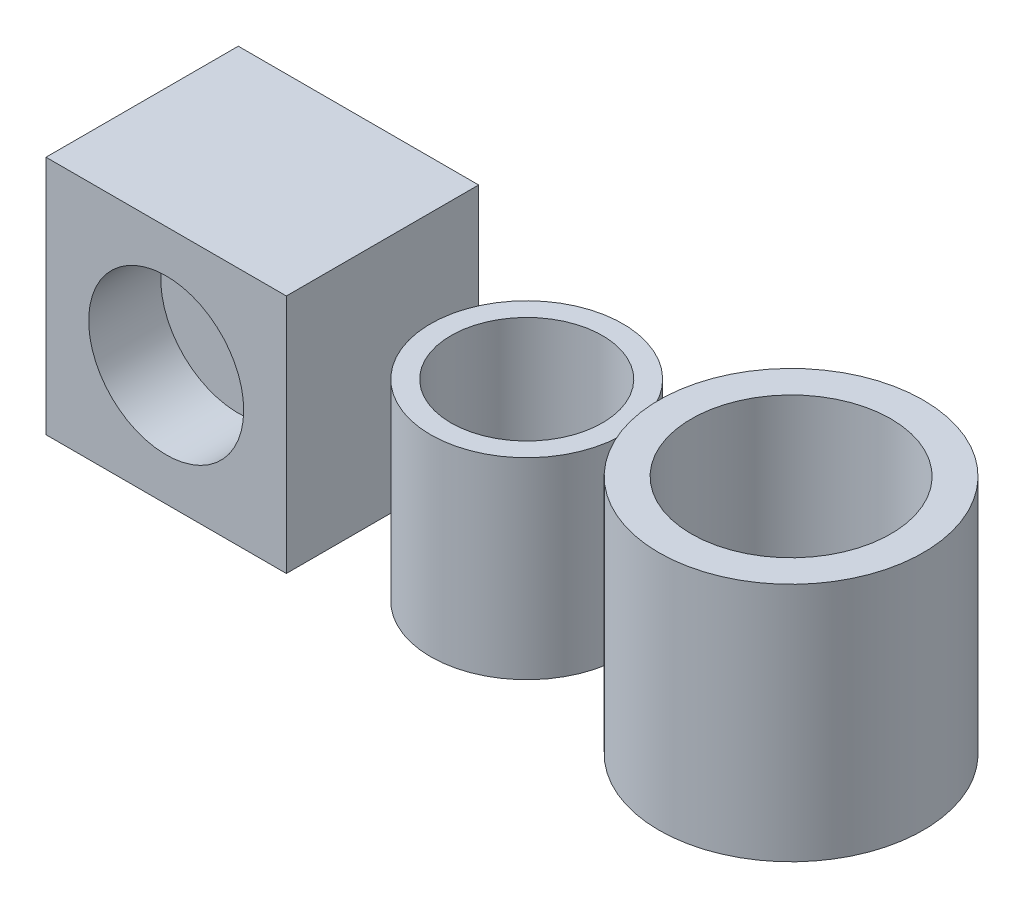
ISO-10303-21;
HEADER;
FILE_DESCRIPTION(('STEP AP214'),'2;1');
FILE_NAME('part.step','',(''),(''),'','','');
FILE_SCHEMA(('AUTOMOTIVE_DESIGN { 1 0 10303 214 1 1 1 1 }'));
ENDSEC;
DATA;
#1=APPLICATION_CONTEXT('core data for automotive mechanical design processes');
#2=APPLICATION_PROTOCOL_DEFINITION('international standard','automotive_design',2000,#1);
#3=PRODUCT_CONTEXT('',#1,'mechanical');
#4=PRODUCT('Part','Part','',(#3));
#5=PRODUCT_RELATED_PRODUCT_CATEGORY('part','',(#4));
#6=PRODUCT_DEFINITION_FORMATION('','',#4);
#7=PRODUCT_DEFINITION_CONTEXT('part definition',#1,'design');
#8=PRODUCT_DEFINITION('design','',#6,#7);
#9=PRODUCT_DEFINITION_SHAPE('','',#8);
#10=(LENGTH_UNIT() NAMED_UNIT(*) SI_UNIT(.MILLI.,.METRE.));
#11=(NAMED_UNIT(*) PLANE_ANGLE_UNIT() SI_UNIT($,.RADIAN.));
#12=(NAMED_UNIT(*) SI_UNIT($,.STERADIAN.) SOLID_ANGLE_UNIT());
#13=UNCERTAINTY_MEASURE_WITH_UNIT(LENGTH_MEASURE(1.E-05),#10,'distance_accuracy_value','');
#14=(GEOMETRIC_REPRESENTATION_CONTEXT(3) GLOBAL_UNCERTAINTY_ASSIGNED_CONTEXT((#13)) GLOBAL_UNIT_ASSIGNED_CONTEXT((#10,
#11,#12)) REPRESENTATION_CONTEXT('',''));
#15=CARTESIAN_POINT('',(0.,0.,0.));
#16=DIRECTION('',(0.,0.,1.));
#17=DIRECTION('',(1.,0.,0.));
#18=AXIS2_PLACEMENT_3D('',#15,#16,#17);
#19=CARTESIAN_POINT('',(-16.,10.,4.));
#20=DIRECTION('',(1.,0.,0.));
#21=DIRECTION('',(0.,0.,-1.));
#22=AXIS2_PLACEMENT_3D('',#19,#20,#21);
#23=PLANE('',#22);
#24=DIRECTION('',(0.,-1.,0.));
#25=VECTOR('',#24,1.);
#26=CARTESIAN_POINT('',(-16.,10.,-4.));
#27=LINE('',#26,#25);
#28=CARTESIAN_POINT('',(-16.,10.,-4.));
#29=VERTEX_POINT('',#28);
#30=CARTESIAN_POINT('',(-16.,0.,-4.));
#31=VERTEX_POINT('',#30);
#32=EDGE_CURVE('E116',#29,#31,#27,.T.);
#33=ORIENTED_EDGE('',*,*,#32,.T.);
#34=DIRECTION('',(0.,0.,-1.));
#35=VECTOR('',#34,1.);
#36=CARTESIAN_POINT('',(-16.,0.,4.));
#37=LINE('',#36,#35);
#38=CARTESIAN_POINT('',(-16.,0.,4.));
#39=VERTEX_POINT('',#38);
#40=EDGE_CURVE('E12',#39,#31,#37,.T.);
#41=ORIENTED_EDGE('',*,*,#40,.F.);
#42=DIRECTION('',(0.,-1.,0.));
#43=VECTOR('',#42,1.);
#44=CARTESIAN_POINT('',(-16.,10.,4.));
#45=LINE('',#44,#43);
#46=CARTESIAN_POINT('',(-16.,10.,4.));
#47=VERTEX_POINT('',#46);
#48=EDGE_CURVE('E100',#47,#39,#45,.T.);
#49=ORIENTED_EDGE('',*,*,#48,.F.);
#50=DIRECTION('',(0.,0.,-1.));
#51=VECTOR('',#50,1.);
#52=CARTESIAN_POINT('',(-16.,10.,4.));
#53=LINE('',#52,#51);
#54=EDGE_CURVE('E112',#47,#29,#53,.T.);
#55=ORIENTED_EDGE('',*,*,#54,.T.);
#56=EDGE_LOOP('',(#33,#41,#49,#55));
#57=FACE_BOUND('',#56,.T.);
#58=ADVANCED_FACE('F48',(#57),#23,.F.);
#59=CARTESIAN_POINT('',(-16.,0.,4.));
#60=DIRECTION('',(0.,1.,0.));
#61=DIRECTION('',(0.,0.,1.));
#62=AXIS2_PLACEMENT_3D('',#59,#60,#61);
#63=PLANE('',#62);
#64=DIRECTION('',(1.,0.,0.));
#65=VECTOR('',#64,1.);
#66=CARTESIAN_POINT('',(-16.,0.,-4.));
#67=LINE('',#66,#65);
#68=CARTESIAN_POINT('',(-6.,0.,-4.));
#69=VERTEX_POINT('',#68);
#70=EDGE_CURVE('E105',#31,#69,#67,.T.);
#71=ORIENTED_EDGE('',*,*,#70,.T.);
#72=DIRECTION('',(0.,0.,-1.));
#73=VECTOR('',#72,1.);
#74=CARTESIAN_POINT('',(-6.,0.,4.));
#75=LINE('',#74,#73);
#76=CARTESIAN_POINT('',(-6.,0.,4.));
#77=VERTEX_POINT('',#76);
#78=EDGE_CURVE('E57',#77,#69,#75,.T.);
#79=ORIENTED_EDGE('',*,*,#78,.F.);
#80=DIRECTION('',(1.,0.,0.));
#81=VECTOR('',#80,1.);
#82=CARTESIAN_POINT('',(-16.,0.,4.));
#83=LINE('',#82,#81);
#84=EDGE_CURVE('E95',#39,#77,#83,.T.);
#85=ORIENTED_EDGE('',*,*,#84,.F.);
#86=ORIENTED_EDGE('',*,*,#40,.T.);
#87=EDGE_LOOP('',(#71,#79,#85,#86));
#88=FACE_BOUND('',#87,.T.);
#89=ADVANCED_FACE('F104',(#88),#63,.F.);
#90=CARTESIAN_POINT('',(-6.,10.,4.));
#91=DIRECTION('',(-1.,0.,0.));
#92=DIRECTION('',(0.,-1.,0.));
#93=AXIS2_PLACEMENT_3D('',#90,#91,#92);
#94=PLANE('',#93);
#95=DIRECTION('',(0.,1.,0.));
#96=VECTOR('',#95,1.);
#97=CARTESIAN_POINT('',(-6.,10.,-4.));
#98=LINE('',#97,#96);
#99=CARTESIAN_POINT('',(-6.,10.,-4.));
#100=VERTEX_POINT('',#99);
#101=EDGE_CURVE('E82',#69,#100,#98,.T.);
#102=ORIENTED_EDGE('',*,*,#101,.T.);
#103=DIRECTION('',(0.,0.,-1.));
#104=VECTOR('',#103,1.);
#105=CARTESIAN_POINT('',(-6.,10.,4.));
#106=LINE('',#105,#104);
#107=CARTESIAN_POINT('',(-6.,10.,4.));
#108=VERTEX_POINT('',#107);
#109=EDGE_CURVE('E107',#108,#100,#106,.T.);
#110=ORIENTED_EDGE('',*,*,#109,.F.);
#111=DIRECTION('',(0.,1.,0.));
#112=VECTOR('',#111,1.);
#113=CARTESIAN_POINT('',(-6.,10.,4.));
#114=LINE('',#113,#112);
#115=EDGE_CURVE('E98',#77,#108,#114,.T.);
#116=ORIENTED_EDGE('',*,*,#115,.F.);
#117=ORIENTED_EDGE('',*,*,#78,.T.);
#118=EDGE_LOOP('',(#102,#110,#116,#117));
#119=FACE_BOUND('',#118,.T.);
#120=ADVANCED_FACE('F108',(#119),#94,.F.);
#121=CARTESIAN_POINT('',(-16.,10.,4.));
#122=DIRECTION('',(0.,-1.,0.));
#123=DIRECTION('',(0.,0.,-1.));
#124=AXIS2_PLACEMENT_3D('',#121,#122,#123);
#125=PLANE('',#124);
#126=DIRECTION('',(-1.,0.,0.));
#127=VECTOR('',#126,1.);
#128=CARTESIAN_POINT('',(-16.,10.,-4.));
#129=LINE('',#128,#127);
#130=EDGE_CURVE('E88',#100,#29,#129,.T.);
#131=ORIENTED_EDGE('',*,*,#130,.T.);
#132=ORIENTED_EDGE('',*,*,#54,.F.);
#133=DIRECTION('',(-1.,0.,0.));
#134=VECTOR('',#133,1.);
#135=CARTESIAN_POINT('',(-16.,10.,4.));
#136=LINE('',#135,#134);
#137=EDGE_CURVE('E65',#108,#47,#136,.T.);
#138=ORIENTED_EDGE('',*,*,#137,.F.);
#139=ORIENTED_EDGE('',*,*,#109,.T.);
#140=EDGE_LOOP('',(#131,#132,#138,#139));
#141=FACE_BOUND('',#140,.T.);
#142=ADVANCED_FACE('F130',(#141),#125,.F.);
#143=CARTESIAN_POINT('',(0.,0.,4.));
#144=DIRECTION('',(0.,0.,1.));
#145=DIRECTION('',(1.,0.,0.));
#146=AXIS2_PLACEMENT_3D('',#143,#144,#145);
#147=PLANE('',#146);
#148=CARTESIAN_POINT('',(-11.,5.,4.));
#149=DIRECTION('',(0.,0.,1.));
#150=DIRECTION('',(1.,0.,0.));
#151=AXIS2_PLACEMENT_3D('',#148,#149,#150);
#152=CIRCLE('',#151,3.225);
#153=CARTESIAN_POINT('',(-7.775,5.,4.));
#154=VERTEX_POINT('',#153);
#155=EDGE_CURVE('E137',#154,#154,#152,.T.);
#156=ORIENTED_EDGE('',*,*,#155,.F.);
#157=EDGE_LOOP('',(#156));
#158=FACE_BOUND('',#157,.T.);
#159=ORIENTED_EDGE('',*,*,#48,.T.);
#160=ORIENTED_EDGE('',*,*,#84,.T.);
#161=ORIENTED_EDGE('',*,*,#115,.T.);
#162=ORIENTED_EDGE('',*,*,#137,.T.);
#163=EDGE_LOOP('',(#159,#160,#161,#162));
#164=FACE_BOUND('',#163,.T.);
#165=ADVANCED_FACE('F96',(#158,#164),#147,.T.);
#166=CARTESIAN_POINT('',(0.,0.,-4.));
#167=DIRECTION('',(0.,0.,1.));
#168=DIRECTION('',(1.,0.,0.));
#169=AXIS2_PLACEMENT_3D('',#166,#167,#168);
#170=PLANE('',#169);
#171=ORIENTED_EDGE('',*,*,#32,.F.);
#172=ORIENTED_EDGE('',*,*,#130,.F.);
#173=ORIENTED_EDGE('',*,*,#101,.F.);
#174=ORIENTED_EDGE('',*,*,#70,.F.);
#175=EDGE_LOOP('',(#171,#172,#173,#174));
#176=FACE_BOUND('',#175,.T.);
#177=ADVANCED_FACE('F133',(#176),#170,.F.);
#178=CARTESIAN_POINT('',(-11.,5.,1.));
#179=DIRECTION('',(0.,0.,1.));
#180=DIRECTION('',(1.,0.,0.));
#181=AXIS2_PLACEMENT_3D('',#178,#179,#180);
#182=CYLINDRICAL_SURFACE('',#181,3.225);
#183=CARTESIAN_POINT('',(-11.,5.,1.));
#184=DIRECTION('',(0.,0.,1.));
#185=DIRECTION('',(1.,0.,0.));
#186=AXIS2_PLACEMENT_3D('',#183,#184,#185);
#187=CIRCLE('',#186,3.225);
#188=CARTESIAN_POINT('',(-7.775,5.,1.));
#189=VERTEX_POINT('',#188);
#190=EDGE_CURVE('E120',#189,#189,#187,.T.);
#191=ORIENTED_EDGE('',*,*,#190,.F.);
#192=EDGE_LOOP('',(#191));
#193=FACE_BOUND('',#192,.T.);
#194=ORIENTED_EDGE('',*,*,#155,.T.);
#195=EDGE_LOOP('',(#194));
#196=FACE_BOUND('',#195,.T.);
#197=ADVANCED_FACE('F147',(#193,#196),#182,.F.);
#198=CARTESIAN_POINT('',(-11.,5.,1.));
#199=DIRECTION('',(0.,0.,1.));
#200=DIRECTION('',(1.,0.,0.));
#201=AXIS2_PLACEMENT_3D('',#198,#199,#200);
#202=PLANE('',#201);
#203=ORIENTED_EDGE('',*,*,#190,.T.);
#204=EDGE_LOOP('',(#203));
#205=FACE_BOUND('',#204,.T.);
#206=ADVANCED_FACE('F145',(#205),#202,.T.);
#207=CLOSED_SHELL('',(#58,#89,#120,#142,#165,#177,#197,#206));
#208=MANIFOLD_SOLID_BREP('B2',#207);
#209=CARTESIAN_POINT('',(11.,10.,0.));
#210=DIRECTION('',(0.,1.,0.));
#211=DIRECTION('',(0.,0.,1.));
#212=AXIS2_PLACEMENT_3D('',#209,#210,#211);
#213=PLANE('',#212);
#214=CARTESIAN_POINT('',(11.,10.,0.));
#215=DIRECTION('',(0.,1.,0.));
#216=DIRECTION('',(0.,0.,1.));
#217=AXIS2_PLACEMENT_3D('',#214,#215,#216);
#218=CIRCLE('',#217,5.5);
#219=CARTESIAN_POINT('',(11.,10.,5.5));
#220=VERTEX_POINT('',#219);
#221=EDGE_CURVE('E47',#220,#220,#218,.T.);
#222=ORIENTED_EDGE('',*,*,#221,.T.);
#223=EDGE_LOOP('',(#222));
#224=FACE_BOUND('',#223,.T.);
#225=CARTESIAN_POINT('',(11.,10.,0.));
#226=DIRECTION('',(0.,1.,0.));
#227=DIRECTION('',(0.,0.,1.));
#228=AXIS2_PLACEMENT_3D('',#225,#226,#227);
#229=CIRCLE('',#228,4.15);
#230=CARTESIAN_POINT('',(11.,10.,4.15));
#231=VERTEX_POINT('',#230);
#232=EDGE_CURVE('E234',#231,#231,#229,.T.);
#233=ORIENTED_EDGE('',*,*,#232,.F.);
#234=EDGE_LOOP('',(#233));
#235=FACE_BOUND('',#234,.T.);
#236=ADVANCED_FACE('F223',(#224,#235),#213,.T.);
#237=CARTESIAN_POINT('',(11.,0.,0.));
#238=DIRECTION('',(0.,1.,0.));
#239=DIRECTION('',(0.,0.,1.));
#240=AXIS2_PLACEMENT_3D('',#237,#238,#239);
#241=PLANE('',#240);
#242=CARTESIAN_POINT('',(11.,0.,0.));
#243=DIRECTION('',(0.,1.,0.));
#244=DIRECTION('',(0.,0.,1.));
#245=AXIS2_PLACEMENT_3D('',#242,#243,#244);
#246=CIRCLE('',#245,5.5);
#247=CARTESIAN_POINT('',(11.,0.,5.5));
#248=VERTEX_POINT('',#247);
#249=EDGE_CURVE('E227',#248,#248,#246,.T.);
#250=ORIENTED_EDGE('',*,*,#249,.F.);
#251=EDGE_LOOP('',(#250));
#252=FACE_BOUND('',#251,.T.);
#253=CARTESIAN_POINT('',(11.,0.,0.));
#254=DIRECTION('',(0.,1.,0.));
#255=DIRECTION('',(0.,0.,1.));
#256=AXIS2_PLACEMENT_3D('',#253,#254,#255);
#257=CIRCLE('',#256,4.15);
#258=CARTESIAN_POINT('',(11.,0.,4.15));
#259=VERTEX_POINT('',#258);
#260=EDGE_CURVE('E236',#259,#259,#257,.T.);
#261=ORIENTED_EDGE('',*,*,#260,.T.);
#262=EDGE_LOOP('',(#261));
#263=FACE_BOUND('',#262,.T.);
#264=ADVANCED_FACE('F246',(#252,#263),#241,.F.);
#265=CARTESIAN_POINT('',(11.,10.,0.));
#266=DIRECTION('',(0.,-1.,0.));
#267=DIRECTION('',(0.,0.,-1.));
#268=AXIS2_PLACEMENT_3D('',#265,#266,#267);
#269=CYLINDRICAL_SURFACE('',#268,5.5);
#270=ORIENTED_EDGE('',*,*,#221,.F.);
#271=EDGE_LOOP('',(#270));
#272=FACE_BOUND('',#271,.T.);
#273=ORIENTED_EDGE('',*,*,#249,.T.);
#274=EDGE_LOOP('',(#273));
#275=FACE_BOUND('',#274,.T.);
#276=ADVANCED_FACE('F225',(#272,#275),#269,.T.);
#277=CARTESIAN_POINT('',(11.,10.,0.));
#278=DIRECTION('',(0.,-1.,0.));
#279=DIRECTION('',(0.,0.,-1.));
#280=AXIS2_PLACEMENT_3D('',#277,#278,#279);
#281=CYLINDRICAL_SURFACE('',#280,4.15);
#282=ORIENTED_EDGE('',*,*,#232,.T.);
#283=EDGE_LOOP('',(#282));
#284=FACE_BOUND('',#283,.T.);
#285=ORIENTED_EDGE('',*,*,#260,.F.);
#286=EDGE_LOOP('',(#285));
#287=FACE_BOUND('',#286,.T.);
#288=ADVANCED_FACE('F242',(#284,#287),#281,.F.);
#289=CLOSED_SHELL('',(#236,#264,#276,#288));
#290=MANIFOLD_SOLID_BREP('B6',#289);
#291=CARTESIAN_POINT('',(0.,8.,0.));
#292=DIRECTION('',(0.,1.,0.));
#293=DIRECTION('',(0.,0.,1.));
#294=AXIS2_PLACEMENT_3D('',#291,#292,#293);
#295=PLANE('',#294);
#296=CARTESIAN_POINT('',(0.,8.,0.));
#297=DIRECTION('',(0.,1.,0.));
#298=DIRECTION('',(0.,0.,1.));
#299=AXIS2_PLACEMENT_3D('',#296,#297,#298);
#300=CIRCLE('',#299,4.);
#301=CARTESIAN_POINT('',(0.,8.,4.));
#302=VERTEX_POINT('',#301);
#303=EDGE_CURVE('E222',#302,#302,#300,.T.);
#304=ORIENTED_EDGE('',*,*,#303,.T.);
#305=EDGE_LOOP('',(#304));
#306=FACE_BOUND('',#305,.T.);
#307=CARTESIAN_POINT('',(0.,8.,0.));
#308=DIRECTION('',(0.,1.,0.));
#309=DIRECTION('',(0.,0.,1.));
#310=AXIS2_PLACEMENT_3D('',#307,#308,#309);
#311=CIRCLE('',#310,3.15);
#312=CARTESIAN_POINT('',(0.,8.,3.15));
#313=VERTEX_POINT('',#312);
#314=EDGE_CURVE('E296',#313,#313,#311,.T.);
#315=ORIENTED_EDGE('',*,*,#314,.F.);
#316=EDGE_LOOP('',(#315));
#317=FACE_BOUND('',#316,.T.);
#318=ADVANCED_FACE('F285',(#306,#317),#295,.T.);
#319=CARTESIAN_POINT('',(0.,0.,0.));
#320=DIRECTION('',(0.,1.,0.));
#321=DIRECTION('',(0.,0.,1.));
#322=AXIS2_PLACEMENT_3D('',#319,#320,#321);
#323=PLANE('',#322);
#324=CARTESIAN_POINT('',(0.,0.,0.));
#325=DIRECTION('',(0.,1.,0.));
#326=DIRECTION('',(0.,0.,1.));
#327=AXIS2_PLACEMENT_3D('',#324,#325,#326);
#328=CIRCLE('',#327,4.);
#329=CARTESIAN_POINT('',(0.,0.,4.));
#330=VERTEX_POINT('',#329);
#331=EDGE_CURVE('E289',#330,#330,#328,.T.);
#332=ORIENTED_EDGE('',*,*,#331,.F.);
#333=EDGE_LOOP('',(#332));
#334=FACE_BOUND('',#333,.T.);
#335=CARTESIAN_POINT('',(0.,0.,0.));
#336=DIRECTION('',(0.,1.,0.));
#337=DIRECTION('',(0.,0.,1.));
#338=AXIS2_PLACEMENT_3D('',#335,#336,#337);
#339=CIRCLE('',#338,3.15);
#340=CARTESIAN_POINT('',(0.,0.,3.15));
#341=VERTEX_POINT('',#340);
#342=EDGE_CURVE('E298',#341,#341,#339,.T.);
#343=ORIENTED_EDGE('',*,*,#342,.T.);
#344=EDGE_LOOP('',(#343));
#345=FACE_BOUND('',#344,.T.);
#346=ADVANCED_FACE('F308',(#334,#345),#323,.F.);
#347=CARTESIAN_POINT('',(0.,8.,0.));
#348=DIRECTION('',(0.,-1.,0.));
#349=DIRECTION('',(0.,0.,-1.));
#350=AXIS2_PLACEMENT_3D('',#347,#348,#349);
#351=CYLINDRICAL_SURFACE('',#350,4.);
#352=ORIENTED_EDGE('',*,*,#303,.F.);
#353=EDGE_LOOP('',(#352));
#354=FACE_BOUND('',#353,.T.);
#355=ORIENTED_EDGE('',*,*,#331,.T.);
#356=EDGE_LOOP('',(#355));
#357=FACE_BOUND('',#356,.T.);
#358=ADVANCED_FACE('F287',(#354,#357),#351,.T.);
#359=CARTESIAN_POINT('',(0.,8.,0.));
#360=DIRECTION('',(0.,-1.,0.));
#361=DIRECTION('',(0.,0.,-1.));
#362=AXIS2_PLACEMENT_3D('',#359,#360,#361);
#363=CYLINDRICAL_SURFACE('',#362,3.15);
#364=ORIENTED_EDGE('',*,*,#314,.T.);
#365=EDGE_LOOP('',(#364));
#366=FACE_BOUND('',#365,.T.);
#367=ORIENTED_EDGE('',*,*,#342,.F.);
#368=EDGE_LOOP('',(#367));
#369=FACE_BOUND('',#368,.T.);
#370=ADVANCED_FACE('F304',(#366,#369),#363,.F.);
#371=CLOSED_SHELL('',(#318,#346,#358,#370));
#372=MANIFOLD_SOLID_BREP('B42',#371);
#373=ADVANCED_BREP_SHAPE_REPRESENTATION('',(#18,#208,#290,#372),#14);
#374=SHAPE_DEFINITION_REPRESENTATION(#9,#373);
ENDSEC;
END-ISO-10303-21;
